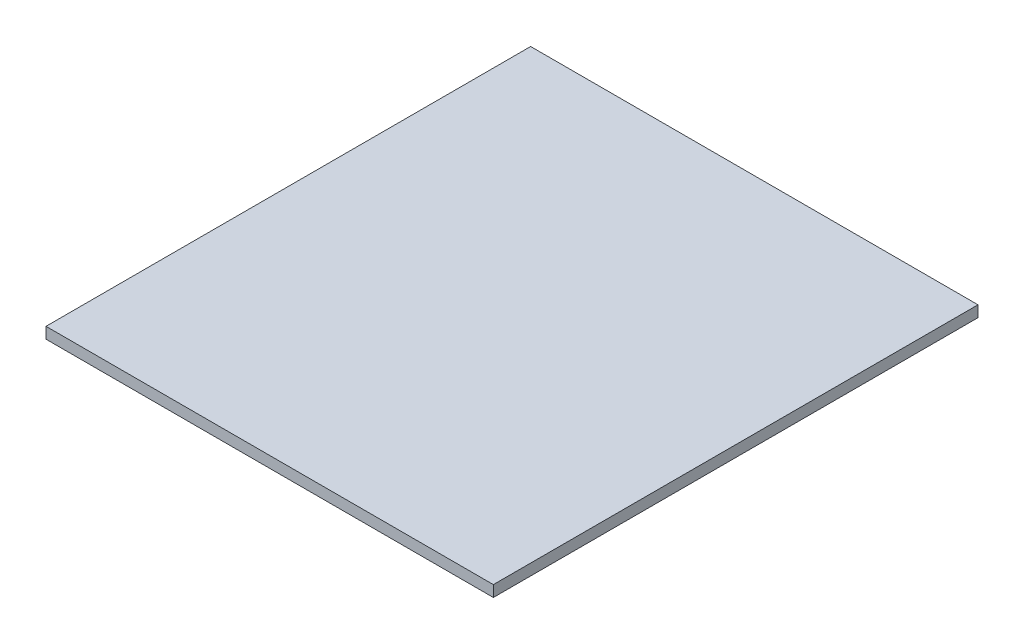
ISO-10303-21;
HEADER;
FILE_DESCRIPTION(('STEP AP214'),'2;1');
FILE_NAME('part.step','',(''),(''),'','','');
FILE_SCHEMA(('AUTOMOTIVE_DESIGN { 1 0 10303 214 1 1 1 1 }'));
ENDSEC;
DATA;
#1=APPLICATION_CONTEXT('core data for automotive mechanical design processes');
#2=APPLICATION_PROTOCOL_DEFINITION('international standard','automotive_design',2000,#1);
#3=PRODUCT_CONTEXT('',#1,'mechanical');
#4=PRODUCT('Part','Part','',(#3));
#5=PRODUCT_RELATED_PRODUCT_CATEGORY('part','',(#4));
#6=PRODUCT_DEFINITION_FORMATION('','',#4);
#7=PRODUCT_DEFINITION_CONTEXT('part definition',#1,'design');
#8=PRODUCT_DEFINITION('design','',#6,#7);
#9=PRODUCT_DEFINITION_SHAPE('','',#8);
#10=(LENGTH_UNIT() NAMED_UNIT(*) SI_UNIT(.MILLI.,.METRE.));
#11=(NAMED_UNIT(*) PLANE_ANGLE_UNIT() SI_UNIT($,.RADIAN.));
#12=(NAMED_UNIT(*) SI_UNIT($,.STERADIAN.) SOLID_ANGLE_UNIT());
#13=UNCERTAINTY_MEASURE_WITH_UNIT(LENGTH_MEASURE(1.E-05),#10,'distance_accuracy_value','');
#14=(GEOMETRIC_REPRESENTATION_CONTEXT(3) GLOBAL_UNCERTAINTY_ASSIGNED_CONTEXT((#13)) GLOBAL_UNIT_ASSIGNED_CONTEXT((#10,
#11,#12)) REPRESENTATION_CONTEXT('',''));
#15=CARTESIAN_POINT('',(0.,0.,0.));
#16=DIRECTION('',(0.,0.,1.));
#17=DIRECTION('',(1.,0.,0.));
#18=AXIS2_PLACEMENT_3D('',#15,#16,#17);
#19=CARTESIAN_POINT('',(30.,40.,32.5));
#20=DIRECTION('',(-1.,0.,0.));
#21=DIRECTION('',(0.,0.,1.));
#22=AXIS2_PLACEMENT_3D('',#19,#20,#21);
#23=PLANE('',#22);
#24=DIRECTION('',(0.,-1.,0.));
#25=VECTOR('',#24,1.);
#26=CARTESIAN_POINT('',(30.,40.,32.5));
#27=LINE('',#26,#25);
#28=CARTESIAN_POINT('',(30.,42.5,32.5));
#29=VERTEX_POINT('',#28);
#30=CARTESIAN_POINT('',(30.,41.,32.5));
#31=VERTEX_POINT('',#30);
#32=EDGE_CURVE('E176',#29,#31,#27,.T.);
#33=ORIENTED_EDGE('',*,*,#32,.T.);
#34=DIRECTION('',(0.,0.,1.));
#35=VECTOR('',#34,1.);
#36=CARTESIAN_POINT('',(30.,41.,-32.5));
#37=LINE('',#36,#35);
#38=CARTESIAN_POINT('',(30.,41.,-32.5));
#39=VERTEX_POINT('',#38);
#40=EDGE_CURVE('E189',#39,#31,#37,.T.);
#41=ORIENTED_EDGE('',*,*,#40,.F.);
#42=DIRECTION('',(0.,-1.,0.));
#43=VECTOR('',#42,1.);
#44=CARTESIAN_POINT('',(30.,40.,-32.5));
#45=LINE('',#44,#43);
#46=CARTESIAN_POINT('',(30.,42.5,-32.5));
#47=VERTEX_POINT('',#46);
#48=EDGE_CURVE('E47',#47,#39,#45,.T.);
#49=ORIENTED_EDGE('',*,*,#48,.F.);
#50=DIRECTION('',(0.,0.,-1.));
#51=VECTOR('',#50,1.);
#52=CARTESIAN_POINT('',(30.,42.5,-32.5));
#53=LINE('',#52,#51);
#54=EDGE_CURVE('E164',#29,#47,#53,.T.);
#55=ORIENTED_EDGE('',*,*,#54,.F.);
#56=EDGE_LOOP('',(#33,#41,#49,#55));
#57=FACE_BOUND('',#56,.T.);
#58=ADVANCED_FACE('F39',(#57),#23,.F.);
#59=CARTESIAN_POINT('',(-30.,40.,-32.5));
#60=DIRECTION('',(0.,0.,1.));
#61=DIRECTION('',(1.,0.,0.));
#62=AXIS2_PLACEMENT_3D('',#59,#60,#61);
#63=PLANE('',#62);
#64=ORIENTED_EDGE('',*,*,#48,.T.);
#65=DIRECTION('',(-1.,0.,0.));
#66=VECTOR('',#65,1.);
#67=CARTESIAN_POINT('',(30.,41.,-32.5));
#68=LINE('',#67,#66);
#69=CARTESIAN_POINT('',(-30.,41.,-32.5));
#70=VERTEX_POINT('',#69);
#71=EDGE_CURVE('E207',#39,#70,#68,.T.);
#72=ORIENTED_EDGE('',*,*,#71,.T.);
#73=DIRECTION('',(0.,-1.,0.));
#74=VECTOR('',#73,1.);
#75=CARTESIAN_POINT('',(-30.,40.,-32.5));
#76=LINE('',#75,#74);
#77=CARTESIAN_POINT('',(-30.,42.5,-32.5));
#78=VERTEX_POINT('',#77);
#79=EDGE_CURVE('E184',#78,#70,#76,.T.);
#80=ORIENTED_EDGE('',*,*,#79,.F.);
#81=DIRECTION('',(-1.,0.,0.));
#82=VECTOR('',#81,1.);
#83=CARTESIAN_POINT('',(31.6970562748477,42.5,-32.5));
#84=LINE('',#83,#82);
#85=EDGE_CURVE('E168',#47,#78,#84,.T.);
#86=ORIENTED_EDGE('',*,*,#85,.F.);
#87=EDGE_LOOP('',(#64,#72,#80,#86));
#88=FACE_BOUND('',#87,.T.);
#89=ADVANCED_FACE('F181',(#88),#63,.F.);
#90=CARTESIAN_POINT('',(-30.,40.,32.5));
#91=DIRECTION('',(1.,0.,0.));
#92=DIRECTION('',(0.,0.,-1.));
#93=AXIS2_PLACEMENT_3D('',#90,#91,#92);
#94=PLANE('',#93);
#95=ORIENTED_EDGE('',*,*,#79,.T.);
#96=DIRECTION('',(0.,0.,1.));
#97=VECTOR('',#96,1.);
#98=CARTESIAN_POINT('',(-30.,41.,-32.5));
#99=LINE('',#98,#97);
#100=CARTESIAN_POINT('',(-30.,41.,32.5));
#101=VERTEX_POINT('',#100);
#102=EDGE_CURVE('E204',#70,#101,#99,.T.);
#103=ORIENTED_EDGE('',*,*,#102,.T.);
#104=DIRECTION('',(0.,-1.,0.));
#105=VECTOR('',#104,1.);
#106=CARTESIAN_POINT('',(-30.,40.,32.5));
#107=LINE('',#106,#105);
#108=CARTESIAN_POINT('',(-30.,42.5,32.5));
#109=VERTEX_POINT('',#108);
#110=EDGE_CURVE('E192',#109,#101,#107,.T.);
#111=ORIENTED_EDGE('',*,*,#110,.F.);
#112=DIRECTION('',(0.,0.,1.));
#113=VECTOR('',#112,1.);
#114=CARTESIAN_POINT('',(-30.,42.5,-32.5));
#115=LINE('',#114,#113);
#116=EDGE_CURVE('E177',#78,#109,#115,.T.);
#117=ORIENTED_EDGE('',*,*,#116,.F.);
#118=EDGE_LOOP('',(#95,#103,#111,#117));
#119=FACE_BOUND('',#118,.T.);
#120=ADVANCED_FACE('F403',(#119),#94,.F.);
#121=CARTESIAN_POINT('',(-30.,40.,32.5));
#122=DIRECTION('',(0.,0.,-1.));
#123=DIRECTION('',(-1.,0.,0.));
#124=AXIS2_PLACEMENT_3D('',#121,#122,#123);
#125=PLANE('',#124);
#126=ORIENTED_EDGE('',*,*,#110,.T.);
#127=DIRECTION('',(1.,0.,0.));
#128=VECTOR('',#127,1.);
#129=CARTESIAN_POINT('',(-30.,41.,32.5));
#130=LINE('',#129,#128);
#131=EDGE_CURVE('E11',#101,#31,#130,.T.);
#132=ORIENTED_EDGE('',*,*,#131,.T.);
#133=ORIENTED_EDGE('',*,*,#32,.F.);
#134=DIRECTION('',(-1.,0.,0.));
#135=VECTOR('',#134,1.);
#136=CARTESIAN_POINT('',(31.6970562748477,42.5,32.5));
#137=LINE('',#136,#135);
#138=EDGE_CURVE('E170',#29,#109,#137,.T.);
#139=ORIENTED_EDGE('',*,*,#138,.T.);
#140=EDGE_LOOP('',(#126,#132,#133,#139));
#141=FACE_BOUND('',#140,.T.);
#142=ADVANCED_FACE('F407',(#141),#125,.F.);
#143=CARTESIAN_POINT('',(30.,41.,-32.5));
#144=DIRECTION('',(0.,1.,0.));
#145=DIRECTION('',(-1.,0.,0.));
#146=AXIS2_PLACEMENT_3D('',#143,#144,#145);
#147=PLANE('',#146);
#148=DIRECTION('',(1.,0.,0.));
#149=VECTOR('',#148,1.);
#150=CARTESIAN_POINT('',(0.,41.,15.4667384651756));
#151=LINE('',#150,#149);
#152=CARTESIAN_POINT('',(-1.98993651574518,41.,15.4667384651756));
#153=VERTEX_POINT('',#152);
#154=CARTESIAN_POINT('',(1.98993651574518,41.,15.4667384651756));
#155=VERTEX_POINT('',#154);
#156=EDGE_CURVE('E356',#153,#155,#151,.T.);
#157=ORIENTED_EDGE('',*,*,#156,.F.);
#158=DIRECTION('',(0.,0.,-1.));
#159=VECTOR('',#158,1.);
#160=CARTESIAN_POINT('',(-1.98993651574518,41.,16.5436615420987));
#161=LINE('',#160,#159);
#162=CARTESIAN_POINT('',(-1.98993651574518,41.,17.4667384651756));
#163=VERTEX_POINT('',#162);
#164=EDGE_CURVE('E285',#163,#153,#161,.T.);
#165=ORIENTED_EDGE('',*,*,#164,.F.);
#166=DIRECTION('',(-1.,0.,0.));
#167=VECTOR('',#166,1.);
#168=CARTESIAN_POINT('',(0.,41.,17.4667384651756));
#169=LINE('',#168,#167);
#170=CARTESIAN_POINT('',(1.98993651574518,41.,17.4667384651756));
#171=VERTEX_POINT('',#170);
#172=EDGE_CURVE('E350',#171,#163,#169,.T.);
#173=ORIENTED_EDGE('',*,*,#172,.F.);
#174=DIRECTION('',(0.,0.,1.));
#175=VECTOR('',#174,1.);
#176=CARTESIAN_POINT('',(1.98993651574518,41.,16.5436615420987));
#177=LINE('',#176,#175);
#178=EDGE_CURVE('E353',#155,#171,#177,.T.);
#179=ORIENTED_EDGE('',*,*,#178,.F.);
#180=EDGE_LOOP('',(#157,#165,#173,#179));
#181=FACE_BOUND('',#180,.T.);
#182=DIRECTION('',(1.,0.,0.));
#183=VECTOR('',#182,1.);
#184=CARTESIAN_POINT('',(0.,41.,-17.4667384651756));
#185=LINE('',#184,#183);
#186=CARTESIAN_POINT('',(-1.98993651574518,41.,-17.4667384651756));
#187=VERTEX_POINT('',#186);
#188=CARTESIAN_POINT('',(1.98993651574518,41.,-17.4667384651756));
#189=VERTEX_POINT('',#188);
#190=EDGE_CURVE('E276',#187,#189,#185,.T.);
#191=ORIENTED_EDGE('',*,*,#190,.F.);
#192=DIRECTION('',(0.,0.,-1.));
#193=VECTOR('',#192,1.);
#194=CARTESIAN_POINT('',(-1.98993651574518,41.,-16.5436615420987));
#195=LINE('',#194,#193);
#196=CARTESIAN_POINT('',(-1.98993651574518,41.,-15.4667384651756));
#197=VERTEX_POINT('',#196);
#198=EDGE_CURVE('E213',#197,#187,#195,.T.);
#199=ORIENTED_EDGE('',*,*,#198,.F.);
#200=DIRECTION('',(-1.,0.,0.));
#201=VECTOR('',#200,1.);
#202=CARTESIAN_POINT('',(0.,41.,-15.4667384651756));
#203=LINE('',#202,#201);
#204=CARTESIAN_POINT('',(1.98993651574518,41.,-15.4667384651756));
#205=VERTEX_POINT('',#204);
#206=EDGE_CURVE('E282',#205,#197,#203,.T.);
#207=ORIENTED_EDGE('',*,*,#206,.F.);
#208=DIRECTION('',(0.,0.,1.));
#209=VECTOR('',#208,1.);
#210=CARTESIAN_POINT('',(1.98993651574518,41.,-16.5436615420987));
#211=LINE('',#210,#209);
#212=EDGE_CURVE('E279',#189,#205,#211,.T.);
#213=ORIENTED_EDGE('',*,*,#212,.F.);
#214=EDGE_LOOP('',(#191,#199,#207,#213));
#215=FACE_BOUND('',#214,.T.);
#216=ORIENTED_EDGE('',*,*,#102,.F.);
#217=ORIENTED_EDGE('',*,*,#71,.F.);
#218=ORIENTED_EDGE('',*,*,#40,.T.);
#219=ORIENTED_EDGE('',*,*,#131,.F.);
#220=EDGE_LOOP('',(#216,#217,#218,#219));
#221=FACE_BOUND('',#220,.T.);
#222=ADVANCED_FACE('F371',(#181,#215,#221),#147,.F.);
#223=CARTESIAN_POINT('',(0.,35.3999999999999,-16.5436615420987));
#224=DIRECTION('',(0.,-1.,0.));
#225=DIRECTION('',(0.,0.,-1.));
#226=AXIS2_PLACEMENT_3D('',#223,#224,#225);
#227=PLANE('',#226);
#228=DIRECTION('',(0.,0.,-1.));
#229=VECTOR('',#228,1.);
#230=CARTESIAN_POINT('',(1.5,35.3999999999999,-16.5436615420987));
#231=LINE('',#230,#229);
#232=CARTESIAN_POINT('',(1.5,35.3999999999999,-16.5436615420987));
#233=VERTEX_POINT('',#232);
#234=CARTESIAN_POINT('',(1.5,35.4,-17.4667384651756));
#235=VERTEX_POINT('',#234);
#236=EDGE_CURVE('E247',#233,#235,#231,.T.);
#237=ORIENTED_EDGE('',*,*,#236,.F.);
#238=DIRECTION('',(1.,0.,0.));
#239=VECTOR('',#238,1.);
#240=CARTESIAN_POINT('',(0.,35.3999999999999,-16.5436615420987));
#241=LINE('',#240,#239);
#242=CARTESIAN_POINT('',(-1.5,35.3999999999999,-16.5436615420987));
#243=VERTEX_POINT('',#242);
#244=EDGE_CURVE('E234',#243,#233,#241,.T.);
#245=ORIENTED_EDGE('',*,*,#244,.F.);
#246=DIRECTION('',(0.,0.,-1.));
#247=VECTOR('',#246,1.);
#248=CARTESIAN_POINT('',(-1.5,35.3999999999999,-16.5436615420987));
#249=LINE('',#248,#247);
#250=CARTESIAN_POINT('',(-1.5,35.3999999999999,-17.4667384651756));
#251=VERTEX_POINT('',#250);
#252=EDGE_CURVE('E239',#243,#251,#249,.T.);
#253=ORIENTED_EDGE('',*,*,#252,.T.);
#254=DIRECTION('',(-1.,0.,0.));
#255=VECTOR('',#254,1.);
#256=CARTESIAN_POINT('',(0.,35.3999999999999,-17.4667384651756));
#257=LINE('',#256,#255);
#258=EDGE_CURVE('E246',#235,#251,#257,.T.);
#259=ORIENTED_EDGE('',*,*,#258,.F.);
#260=EDGE_LOOP('',(#237,#245,#253,#259));
#261=FACE_BOUND('',#260,.T.);
#262=ADVANCED_FACE('F416',(#261),#227,.T.);
#263=CARTESIAN_POINT('',(0.,35.4,-17.4667384651756));
#264=DIRECTION('',(0.,-0.371390676354104,-0.928476690885259));
#265=DIRECTION('',(0.,0.928476690885259,-0.371390676354104));
#266=AXIS2_PLACEMENT_3D('',#263,#264,#265);
#267=PLANE('',#266);
#268=DIRECTION('',(1.,0.,0.));
#269=VECTOR('',#268,1.);
#270=CARTESIAN_POINT('',(0.,37.9,-18.4667384651756));
#271=LINE('',#270,#269);
#272=CARTESIAN_POINT('',(-1.71872165881481,37.9,-18.4667384651756));
#273=VERTEX_POINT('',#272);
#274=CARTESIAN_POINT('',(1.71872165881482,37.9,-18.4667384651756));
#275=VERTEX_POINT('',#274);
#276=EDGE_CURVE('E225',#273,#275,#271,.T.);
#277=ORIENTED_EDGE('',*,*,#276,.T.);
#278=DIRECTION('',(-0.0809645016546911,-0.925428488580126,0.37017139543205));
#279=VECTOR('',#278,1.);
#280=CARTESIAN_POINT('',(1.47233469917725,35.0837841646243,-17.3402521310254));
#281=LINE('',#280,#279);
#282=EDGE_CURVE('E243',#275,#235,#281,.T.);
#283=ORIENTED_EDGE('',*,*,#282,.T.);
#284=ORIENTED_EDGE('',*,*,#258,.T.);
#285=DIRECTION('',(-0.0809645016546913,0.925428488580126,-0.37017139543205));
#286=VECTOR('',#285,1.);
#287=CARTESIAN_POINT('',(-1.47233469917725,35.0837841646243,-17.3402521310254));
#288=LINE('',#287,#286);
#289=EDGE_CURVE('E229',#251,#273,#288,.T.);
#290=ORIENTED_EDGE('',*,*,#289,.T.);
#291=EDGE_LOOP('',(#277,#283,#284,#290));
#292=FACE_BOUND('',#291,.T.);
#293=ADVANCED_FACE('F439',(#292),#267,.T.);
#294=CARTESIAN_POINT('',(0.,38.4,-18.4667384651756));
#295=DIRECTION('',(0.,0.,1.));
#296=DIRECTION('',(1.,0.,0.));
#297=AXIS2_PLACEMENT_3D('',#294,#295,#296);
#298=PLANE('',#297);
#299=ORIENTED_EDGE('',*,*,#276,.F.);
#300=DIRECTION('',(0.0871557427476585,-0.996194698091746,0.));
#301=VECTOR('',#300,1.);
#302=CARTESIAN_POINT('',(-1.5,35.3999999999999,-18.4667384651756));
#303=LINE('',#302,#301);
#304=CARTESIAN_POINT('',(-1.76246599057778,38.4,-18.4667384651756));
#305=VERTEX_POINT('',#304);
#306=EDGE_CURVE('E272',#305,#273,#303,.T.);
#307=ORIENTED_EDGE('',*,*,#306,.F.);
#308=DIRECTION('',(-1.,0.,0.));
#309=VECTOR('',#308,1.);
#310=CARTESIAN_POINT('',(0.,38.4,-18.4667384651756));
#311=LINE('',#310,#309);
#312=CARTESIAN_POINT('',(1.76246599057778,38.4,-18.4667384651756));
#313=VERTEX_POINT('',#312);
#314=EDGE_CURVE('E216',#313,#305,#311,.T.);
#315=ORIENTED_EDGE('',*,*,#314,.F.);
#316=DIRECTION('',(0.0871557427476582,0.996194698091746,0.));
#317=VECTOR('',#316,1.);
#318=CARTESIAN_POINT('',(1.5,35.3999999999999,-18.4667384651756));
#319=LINE('',#318,#317);
#320=EDGE_CURVE('E268',#275,#313,#319,.T.);
#321=ORIENTED_EDGE('',*,*,#320,.F.);
#322=EDGE_LOOP('',(#299,#307,#315,#321));
#323=FACE_BOUND('',#322,.T.);
#324=ADVANCED_FACE('F421',(#323),#298,.F.);
#325=CARTESIAN_POINT('',(0.,38.4,-17.4667384651756));
#326=DIRECTION('',(0.,1.,0.));
#327=DIRECTION('',(0.,0.,1.));
#328=AXIS2_PLACEMENT_3D('',#325,#326,#327);
#329=PLANE('',#328);
#330=ORIENTED_EDGE('',*,*,#314,.T.);
#331=DIRECTION('',(0.,0.,-1.));
#332=VECTOR('',#331,1.);
#333=CARTESIAN_POINT('',(-1.76246599057778,38.4,-17.4667384651756));
#334=LINE('',#333,#332);
#335=CARTESIAN_POINT('',(-1.76246599057778,38.4,-17.4667384651756));
#336=VERTEX_POINT('',#335);
#337=EDGE_CURVE('E220',#336,#305,#334,.T.);
#338=ORIENTED_EDGE('',*,*,#337,.F.);
#339=DIRECTION('',(-1.,0.,0.));
#340=VECTOR('',#339,1.);
#341=CARTESIAN_POINT('',(0.,38.4,-17.4667384651756));
#342=LINE('',#341,#340);
#343=CARTESIAN_POINT('',(1.76246599057778,38.4,-17.4667384651756));
#344=VERTEX_POINT('',#343);
#345=EDGE_CURVE('E235',#344,#336,#342,.T.);
#346=ORIENTED_EDGE('',*,*,#345,.F.);
#347=DIRECTION('',(0.,0.,-1.));
#348=VECTOR('',#347,1.);
#349=CARTESIAN_POINT('',(1.76246599057778,38.4,-16.5436615420987));
#350=LINE('',#349,#348);
#351=EDGE_CURVE('E224',#344,#313,#350,.T.);
#352=ORIENTED_EDGE('',*,*,#351,.T.);
#353=EDGE_LOOP('',(#330,#338,#346,#352));
#354=FACE_BOUND('',#353,.T.);
#355=ADVANCED_FACE('F417',(#354),#329,.T.);
#356=CARTESIAN_POINT('',(-1.5,35.3999999999999,-16.5436615420987));
#357=DIRECTION('',(-0.996194698091746,-0.0871557427476585,0.));
#358=DIRECTION('',(0.0871557427476585,-0.996194698091746,0.));
#359=AXIS2_PLACEMENT_3D('',#356,#357,#358);
#360=PLANE('',#359);
#361=DIRECTION('',(0.0855990965861236,-0.978402151048509,-0.188154259817019));
#362=VECTOR('',#361,1.);
#363=CARTESIAN_POINT('',(-1.5,35.3999999999999,-16.5436615420987));
#364=LINE('',#363,#362);
#365=EDGE_CURVE('E236',#197,#243,#364,.T.);
#366=ORIENTED_EDGE('',*,*,#365,.F.);
#367=ORIENTED_EDGE('',*,*,#198,.T.);
#368=DIRECTION('',(-0.0871557427476585,0.996194698091746,0.));
#369=VECTOR('',#368,1.);
#370=CARTESIAN_POINT('',(-1.5,35.3999999999999,-17.4667384651756));
#371=LINE('',#370,#369);
#372=EDGE_CURVE('E62',#336,#187,#371,.T.);
#373=ORIENTED_EDGE('',*,*,#372,.F.);
#374=ORIENTED_EDGE('',*,*,#337,.T.);
#375=ORIENTED_EDGE('',*,*,#306,.T.);
#376=ORIENTED_EDGE('',*,*,#289,.F.);
#377=ORIENTED_EDGE('',*,*,#252,.F.);
#378=EDGE_LOOP('',(#366,#367,#373,#374,#375,#376,#377));
#379=FACE_BOUND('',#378,.T.);
#380=ADVANCED_FACE('F420',(#379),#360,.T.);
#381=CARTESIAN_POINT('',(0.,35.3999999999999,-16.5436615420987));
#382=DIRECTION('',(0.,-0.188847393650123,0.982006446980648));
#383=DIRECTION('',(0.,-0.982006446980648,-0.188847393650123));
#384=AXIS2_PLACEMENT_3D('',#381,#382,#383);
#385=PLANE('',#384);
#386=DIRECTION('',(0.0855990965861233,0.978402151048509,0.188154259817019));
#387=VECTOR('',#386,1.);
#388=CARTESIAN_POINT('',(1.5,35.3999999999999,-16.5436615420987));
#389=LINE('',#388,#387);
#390=EDGE_CURVE('E230',#233,#205,#389,.T.);
#391=ORIENTED_EDGE('',*,*,#390,.T.);
#392=ORIENTED_EDGE('',*,*,#206,.T.);
#393=ORIENTED_EDGE('',*,*,#365,.T.);
#394=ORIENTED_EDGE('',*,*,#244,.T.);
#395=EDGE_LOOP('',(#391,#392,#393,#394));
#396=FACE_BOUND('',#395,.T.);
#397=ADVANCED_FACE('F423',(#396),#385,.T.);
#398=CARTESIAN_POINT('',(1.5,35.3999999999999,-16.5436615420987));
#399=DIRECTION('',(0.996194698091746,-0.0871557427476582,0.));
#400=DIRECTION('',(0.0871557427476582,0.996194698091746,0.));
#401=AXIS2_PLACEMENT_3D('',#398,#399,#400);
#402=PLANE('',#401);
#403=DIRECTION('',(-0.0871557427476582,-0.996194698091746,0.));
#404=VECTOR('',#403,1.);
#405=CARTESIAN_POINT('',(1.5,35.3999999999999,-17.4667384651756));
#406=LINE('',#405,#404);
#407=EDGE_CURVE('E219',#189,#344,#406,.T.);
#408=ORIENTED_EDGE('',*,*,#407,.F.);
#409=ORIENTED_EDGE('',*,*,#212,.T.);
#410=ORIENTED_EDGE('',*,*,#390,.F.);
#411=ORIENTED_EDGE('',*,*,#236,.T.);
#412=ORIENTED_EDGE('',*,*,#282,.F.);
#413=ORIENTED_EDGE('',*,*,#320,.T.);
#414=ORIENTED_EDGE('',*,*,#351,.F.);
#415=EDGE_LOOP('',(#408,#409,#410,#411,#412,#413,#414));
#416=FACE_BOUND('',#415,.T.);
#417=ADVANCED_FACE('F426',(#416),#402,.T.);
#418=CARTESIAN_POINT('',(0.,538.2,-17.4667384651756));
#419=DIRECTION('',(0.,0.,-1.));
#420=DIRECTION('',(-1.,0.,0.));
#421=AXIS2_PLACEMENT_3D('',#418,#419,#420);
#422=PLANE('',#421);
#423=ORIENTED_EDGE('',*,*,#372,.T.);
#424=ORIENTED_EDGE('',*,*,#190,.T.);
#425=ORIENTED_EDGE('',*,*,#407,.T.);
#426=ORIENTED_EDGE('',*,*,#345,.T.);
#427=EDGE_LOOP('',(#423,#424,#425,#426));
#428=FACE_BOUND('',#427,.T.);
#429=ADVANCED_FACE('F433',(#428),#422,.T.);
#430=CARTESIAN_POINT('',(0.,38.4,17.4667384651756));
#431=DIRECTION('',(0.,1.,0.));
#432=DIRECTION('',(0.,0.,-1.));
#433=AXIS2_PLACEMENT_3D('',#430,#431,#432);
#434=PLANE('',#433);
#435=DIRECTION('',(-1.,0.,0.));
#436=VECTOR('',#435,1.);
#437=CARTESIAN_POINT('',(0.,38.4,18.4667384651756));
#438=LINE('',#437,#436);
#439=CARTESIAN_POINT('',(1.76246599057778,38.4,18.4667384651756));
#440=VERTEX_POINT('',#439);
#441=CARTESIAN_POINT('',(-1.76246599057778,38.4,18.4667384651756));
#442=VERTEX_POINT('',#441);
#443=EDGE_CURVE('E288',#440,#442,#438,.T.);
#444=ORIENTED_EDGE('',*,*,#443,.F.);
#445=DIRECTION('',(0.,0.,1.));
#446=VECTOR('',#445,1.);
#447=CARTESIAN_POINT('',(1.76246599057778,38.4,16.5436615420987));
#448=LINE('',#447,#446);
#449=CARTESIAN_POINT('',(1.76246599057778,38.4,17.4667384651756));
#450=VERTEX_POINT('',#449);
#451=EDGE_CURVE('E295',#450,#440,#448,.T.);
#452=ORIENTED_EDGE('',*,*,#451,.F.);
#453=DIRECTION('',(-1.,0.,0.));
#454=VECTOR('',#453,1.);
#455=CARTESIAN_POINT('',(0.,38.4,17.4667384651756));
#456=LINE('',#455,#454);
#457=CARTESIAN_POINT('',(-1.76246599057778,38.4,17.4667384651756));
#458=VERTEX_POINT('',#457);
#459=EDGE_CURVE('E306',#450,#458,#456,.T.);
#460=ORIENTED_EDGE('',*,*,#459,.T.);
#461=DIRECTION('',(0.,0.,1.));
#462=VECTOR('',#461,1.);
#463=CARTESIAN_POINT('',(-1.76246599057778,38.4,17.4667384651756));
#464=LINE('',#463,#462);
#465=EDGE_CURVE('E291',#458,#442,#464,.T.);
#466=ORIENTED_EDGE('',*,*,#465,.T.);
#467=EDGE_LOOP('',(#444,#452,#460,#466));
#468=FACE_BOUND('',#467,.T.);
#469=ADVANCED_FACE('F379',(#468),#434,.T.);
#470=CARTESIAN_POINT('',(0.,38.4,18.4667384651756));
#471=DIRECTION('',(0.,0.,-1.));
#472=DIRECTION('',(1.,0.,0.));
#473=AXIS2_PLACEMENT_3D('',#470,#471,#472);
#474=PLANE('',#473);
#475=DIRECTION('',(1.,0.,0.));
#476=VECTOR('',#475,1.);
#477=CARTESIAN_POINT('',(0.,37.9,18.4667384651756));
#478=LINE('',#477,#476);
#479=CARTESIAN_POINT('',(-1.71872165881481,37.9,18.4667384651756));
#480=VERTEX_POINT('',#479);
#481=CARTESIAN_POINT('',(1.71872165881482,37.9,18.4667384651756));
#482=VERTEX_POINT('',#481);
#483=EDGE_CURVE('E296',#480,#482,#478,.T.);
#484=ORIENTED_EDGE('',*,*,#483,.T.);
#485=DIRECTION('',(0.0871557427476582,0.996194698091746,0.));
#486=VECTOR('',#485,1.);
#487=CARTESIAN_POINT('',(1.5,35.3999999999999,18.4667384651756));
#488=LINE('',#487,#486);
#489=EDGE_CURVE('E342',#482,#440,#488,.T.);
#490=ORIENTED_EDGE('',*,*,#489,.T.);
#491=ORIENTED_EDGE('',*,*,#443,.T.);
#492=DIRECTION('',(0.0871557427476585,-0.996194698091746,0.));
#493=VECTOR('',#492,1.);
#494=CARTESIAN_POINT('',(-1.5,35.3999999999999,18.4667384651756));
#495=LINE('',#494,#493);
#496=EDGE_CURVE('E346',#442,#480,#495,.T.);
#497=ORIENTED_EDGE('',*,*,#496,.T.);
#498=EDGE_LOOP('',(#484,#490,#491,#497));
#499=FACE_BOUND('',#498,.T.);
#500=ADVANCED_FACE('F383',(#499),#474,.F.);
#501=CARTESIAN_POINT('',(0.,35.4,17.4667384651756));
#502=DIRECTION('',(0.,-0.371390676354104,0.928476690885259));
#503=DIRECTION('',(0.,0.928476690885259,0.371390676354104));
#504=AXIS2_PLACEMENT_3D('',#501,#502,#503);
#505=PLANE('',#504);
#506=ORIENTED_EDGE('',*,*,#483,.F.);
#507=DIRECTION('',(-0.0809645016546913,0.925428488580126,0.37017139543205));
#508=VECTOR('',#507,1.);
#509=CARTESIAN_POINT('',(-1.47233469917725,35.0837841646243,17.3402521310254));
#510=LINE('',#509,#508);
#511=CARTESIAN_POINT('',(-1.5,35.3999999999999,17.4667384651756));
#512=VERTEX_POINT('',#511);
#513=EDGE_CURVE('E300',#512,#480,#510,.T.);
#514=ORIENTED_EDGE('',*,*,#513,.F.);
#515=DIRECTION('',(-1.,0.,0.));
#516=VECTOR('',#515,1.);
#517=CARTESIAN_POINT('',(0.,35.3999999999999,17.4667384651756));
#518=LINE('',#517,#516);
#519=CARTESIAN_POINT('',(1.5,35.4,17.4667384651756));
#520=VERTEX_POINT('',#519);
#521=EDGE_CURVE('E319',#520,#512,#518,.T.);
#522=ORIENTED_EDGE('',*,*,#521,.F.);
#523=DIRECTION('',(-0.0809645016546911,-0.925428488580126,-0.37017139543205));
#524=VECTOR('',#523,1.);
#525=CARTESIAN_POINT('',(1.47233469917725,35.0837841646243,17.3402521310254));
#526=LINE('',#525,#524);
#527=EDGE_CURVE('E314',#482,#520,#526,.T.);
#528=ORIENTED_EDGE('',*,*,#527,.F.);
#529=EDGE_LOOP('',(#506,#514,#522,#528));
#530=FACE_BOUND('',#529,.T.);
#531=ADVANCED_FACE('F386',(#530),#505,.T.);
#532=CARTESIAN_POINT('',(0.,35.3999999999999,16.5436615420987));
#533=DIRECTION('',(0.,-1.,0.));
#534=DIRECTION('',(0.,0.,1.));
#535=AXIS2_PLACEMENT_3D('',#532,#533,#534);
#536=PLANE('',#535);
#537=DIRECTION('',(0.,0.,1.));
#538=VECTOR('',#537,1.);
#539=CARTESIAN_POINT('',(1.5,35.3999999999999,16.5436615420987));
#540=LINE('',#539,#538);
#541=CARTESIAN_POINT('',(1.5,35.3999999999999,16.5436615420987));
#542=VERTEX_POINT('',#541);
#543=EDGE_CURVE('E320',#542,#520,#540,.T.);
#544=ORIENTED_EDGE('',*,*,#543,.T.);
#545=ORIENTED_EDGE('',*,*,#521,.T.);
#546=DIRECTION('',(0.,0.,1.));
#547=VECTOR('',#546,1.);
#548=CARTESIAN_POINT('',(-1.5,35.3999999999999,16.5436615420987));
#549=LINE('',#548,#547);
#550=CARTESIAN_POINT('',(-1.5,35.3999999999999,16.5436615420987));
#551=VERTEX_POINT('',#550);
#552=EDGE_CURVE('E310',#551,#512,#549,.T.);
#553=ORIENTED_EDGE('',*,*,#552,.F.);
#554=DIRECTION('',(1.,0.,0.));
#555=VECTOR('',#554,1.);
#556=CARTESIAN_POINT('',(0.,35.3999999999999,16.5436615420987));
#557=LINE('',#556,#555);
#558=EDGE_CURVE('E305',#551,#542,#557,.T.);
#559=ORIENTED_EDGE('',*,*,#558,.T.);
#560=EDGE_LOOP('',(#544,#545,#553,#559));
#561=FACE_BOUND('',#560,.T.);
#562=ADVANCED_FACE('F389',(#561),#536,.T.);
#563=CARTESIAN_POINT('',(-1.5,35.3999999999999,16.5436615420987));
#564=DIRECTION('',(-0.996194698091746,-0.0871557427476585,0.));
#565=DIRECTION('',(0.0871557427476585,-0.996194698091746,0.));
#566=AXIS2_PLACEMENT_3D('',#563,#564,#565);
#567=PLANE('',#566);
#568=DIRECTION('',(-0.0871557427476585,0.996194698091746,0.));
#569=VECTOR('',#568,1.);
#570=CARTESIAN_POINT('',(-1.5,35.3999999999999,17.4667384651756));
#571=LINE('',#570,#569);
#572=EDGE_CURVE('E315',#458,#163,#571,.T.);
#573=ORIENTED_EDGE('',*,*,#572,.T.);
#574=ORIENTED_EDGE('',*,*,#164,.T.);
#575=DIRECTION('',(0.0855990965861236,-0.978402151048509,0.188154259817019));
#576=VECTOR('',#575,1.);
#577=CARTESIAN_POINT('',(-1.5,35.3999999999999,16.5436615420987));
#578=LINE('',#577,#576);
#579=EDGE_CURVE('E307',#153,#551,#578,.T.);
#580=ORIENTED_EDGE('',*,*,#579,.T.);
#581=ORIENTED_EDGE('',*,*,#552,.T.);
#582=ORIENTED_EDGE('',*,*,#513,.T.);
#583=ORIENTED_EDGE('',*,*,#496,.F.);
#584=ORIENTED_EDGE('',*,*,#465,.F.);
#585=EDGE_LOOP('',(#573,#574,#580,#581,#582,#583,#584));
#586=FACE_BOUND('',#585,.T.);
#587=ADVANCED_FACE('F376',(#586),#567,.T.);
#588=CARTESIAN_POINT('',(0.,35.3999999999999,16.5436615420987));
#589=DIRECTION('',(0.,-0.188847393650123,-0.982006446980648));
#590=DIRECTION('',(0.,-0.982006446980648,0.188847393650123));
#591=AXIS2_PLACEMENT_3D('',#588,#589,#590);
#592=PLANE('',#591);
#593=ORIENTED_EDGE('',*,*,#579,.F.);
#594=ORIENTED_EDGE('',*,*,#156,.T.);
#595=DIRECTION('',(0.0855990965861233,0.978402151048509,-0.188154259817019));
#596=VECTOR('',#595,1.);
#597=CARTESIAN_POINT('',(1.5,35.3999999999999,16.5436615420987));
#598=LINE('',#597,#596);
#599=EDGE_CURVE('E301',#542,#155,#598,.T.);
#600=ORIENTED_EDGE('',*,*,#599,.F.);
#601=ORIENTED_EDGE('',*,*,#558,.F.);
#602=EDGE_LOOP('',(#593,#594,#600,#601));
#603=FACE_BOUND('',#602,.T.);
#604=ADVANCED_FACE('F362',(#603),#592,.T.);
#605=CARTESIAN_POINT('',(1.5,35.3999999999999,16.5436615420987));
#606=DIRECTION('',(0.996194698091746,-0.0871557427476582,0.));
#607=DIRECTION('',(0.0871557427476582,0.996194698091746,0.));
#608=AXIS2_PLACEMENT_3D('',#605,#606,#607);
#609=PLANE('',#608);
#610=ORIENTED_EDGE('',*,*,#599,.T.);
#611=ORIENTED_EDGE('',*,*,#178,.T.);
#612=DIRECTION('',(-0.0871557427476582,-0.996194698091746,0.));
#613=VECTOR('',#612,1.);
#614=CARTESIAN_POINT('',(1.5,35.3999999999999,17.4667384651756));
#615=LINE('',#614,#613);
#616=EDGE_CURVE('E54',#171,#450,#615,.T.);
#617=ORIENTED_EDGE('',*,*,#616,.T.);
#618=ORIENTED_EDGE('',*,*,#451,.T.);
#619=ORIENTED_EDGE('',*,*,#489,.F.);
#620=ORIENTED_EDGE('',*,*,#527,.T.);
#621=ORIENTED_EDGE('',*,*,#543,.F.);
#622=EDGE_LOOP('',(#610,#611,#617,#618,#619,#620,#621));
#623=FACE_BOUND('',#622,.T.);
#624=ADVANCED_FACE('F369',(#623),#609,.T.);
#625=CARTESIAN_POINT('',(0.,538.2,17.4667384651756));
#626=DIRECTION('',(0.,0.,1.));
#627=DIRECTION('',(-1.,0.,0.));
#628=AXIS2_PLACEMENT_3D('',#625,#626,#627);
#629=PLANE('',#628);
#630=ORIENTED_EDGE('',*,*,#616,.F.);
#631=ORIENTED_EDGE('',*,*,#172,.T.);
#632=ORIENTED_EDGE('',*,*,#572,.F.);
#633=ORIENTED_EDGE('',*,*,#459,.F.);
#634=EDGE_LOOP('',(#630,#631,#632,#633));
#635=FACE_BOUND('',#634,.T.);
#636=ADVANCED_FACE('F374',(#635),#629,.T.);
#637=CARTESIAN_POINT('',(30.,42.5,32.5));
#638=DIRECTION('',(0.,-1.,0.));
#639=DIRECTION('',(0.,0.,-1.));
#640=AXIS2_PLACEMENT_3D('',#637,#638,#639);
#641=PLANE('',#640);
#642=ORIENTED_EDGE('',*,*,#116,.T.);
#643=ORIENTED_EDGE('',*,*,#138,.F.);
#644=ORIENTED_EDGE('',*,*,#54,.T.);
#645=ORIENTED_EDGE('',*,*,#85,.T.);
#646=EDGE_LOOP('',(#642,#643,#644,#645));
#647=FACE_BOUND('',#646,.T.);
#648=ADVANCED_FACE('F167',(#647),#641,.F.);
#649=CLOSED_SHELL('',(#58,#89,#120,#142,#222,#262,#293,#324,#355,#380,#397,#417,#429,#469,#500,
#531,#562,#587,#604,#624,#636,#648));
#650=MANIFOLD_SOLID_BREP('B2',#649);
#651=ADVANCED_BREP_SHAPE_REPRESENTATION('',(#18,#650),#14);
#652=SHAPE_DEFINITION_REPRESENTATION(#9,#651);
ENDSEC;
END-ISO-10303-21;
